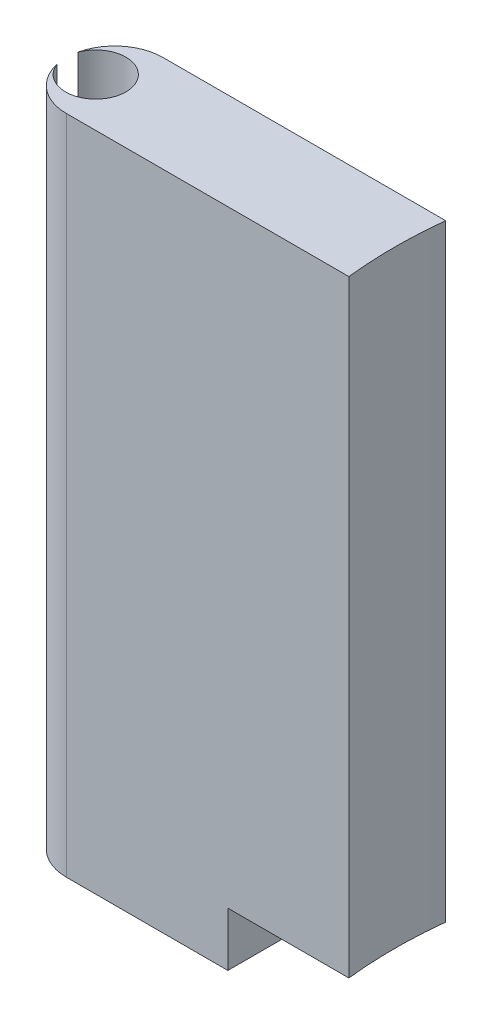
ISO-10303-21;
HEADER;
FILE_DESCRIPTION(('STEP AP214'),'2;1');
FILE_NAME('part.step','',(''),(''),'','','');
FILE_SCHEMA(('AUTOMOTIVE_DESIGN { 1 0 10303 214 1 1 1 1 }'));
ENDSEC;
DATA;
#1=APPLICATION_CONTEXT('core data for automotive mechanical design processes');
#2=APPLICATION_PROTOCOL_DEFINITION('international standard','automotive_design',2000,#1);
#3=PRODUCT_CONTEXT('',#1,'mechanical');
#4=PRODUCT('Part','Part','',(#3));
#5=PRODUCT_RELATED_PRODUCT_CATEGORY('part','',(#4));
#6=PRODUCT_DEFINITION_FORMATION('','',#4);
#7=PRODUCT_DEFINITION_CONTEXT('part definition',#1,'design');
#8=PRODUCT_DEFINITION('design','',#6,#7);
#9=PRODUCT_DEFINITION_SHAPE('','',#8);
#10=(LENGTH_UNIT() NAMED_UNIT(*) SI_UNIT(.MILLI.,.METRE.));
#11=(NAMED_UNIT(*) PLANE_ANGLE_UNIT() SI_UNIT($,.RADIAN.));
#12=(NAMED_UNIT(*) SI_UNIT($,.STERADIAN.) SOLID_ANGLE_UNIT());
#13=UNCERTAINTY_MEASURE_WITH_UNIT(LENGTH_MEASURE(1.E-05),#10,'distance_accuracy_value','');
#14=(GEOMETRIC_REPRESENTATION_CONTEXT(3) GLOBAL_UNCERTAINTY_ASSIGNED_CONTEXT((#13)) GLOBAL_UNIT_ASSIGNED_CONTEXT((#10,
#11,#12)) REPRESENTATION_CONTEXT('',''));
#15=CARTESIAN_POINT('',(0.,0.,0.));
#16=DIRECTION('',(0.,0.,1.));
#17=DIRECTION('',(1.,0.,0.));
#18=AXIS2_PLACEMENT_3D('',#15,#16,#17);
#19=CARTESIAN_POINT('',(-113.595187486441,104.14,0.));
#20=DIRECTION('',(0.,-1.,0.));
#21=DIRECTION('',(0.,0.,-1.));
#22=AXIS2_PLACEMENT_3D('',#19,#20,#21);
#23=CYLINDRICAL_SURFACE('',#22,7.62);
#24=CARTESIAN_POINT('',(-113.595187486441,0.,0.));
#25=DIRECTION('',(0.,1.,0.));
#26=DIRECTION('',(0.,0.,1.));
#27=AXIS2_PLACEMENT_3D('',#24,#25,#26);
#28=CIRCLE('',#27,7.62);
#29=CARTESIAN_POINT('',(-113.595187486441,0.,-7.62000000000001));
#30=VERTEX_POINT('',#29);
#31=CARTESIAN_POINT('',(-121.036253930142,0.,-1.64162425068353));
#32=VERTEX_POINT('',#31);
#33=EDGE_CURVE('E158',#30,#32,#28,.T.);
#34=ORIENTED_EDGE('',*,*,#33,.T.);
#35=DIRECTION('',(0.,1.,0.));
#36=VECTOR('',#35,1.);
#37=CARTESIAN_POINT('',(-121.036253930142,52.07,-1.64162425068353));
#38=LINE('',#37,#36);
#39=CARTESIAN_POINT('',(-121.036253930142,104.14,-1.64162425068353));
#40=VERTEX_POINT('',#39);
#41=EDGE_CURVE('E69',#32,#40,#38,.T.);
#42=ORIENTED_EDGE('',*,*,#41,.T.);
#43=CARTESIAN_POINT('',(-113.595187486441,104.14,0.));
#44=DIRECTION('',(0.,1.,0.));
#45=DIRECTION('',(0.,0.,1.));
#46=AXIS2_PLACEMENT_3D('',#43,#44,#45);
#47=CIRCLE('',#46,7.62);
#48=CARTESIAN_POINT('',(-113.595187486441,104.14,-7.62000000000001));
#49=VERTEX_POINT('',#48);
#50=EDGE_CURVE('E170',#49,#40,#47,.T.);
#51=ORIENTED_EDGE('',*,*,#50,.F.);
#52=DIRECTION('',(0.,-1.,0.));
#53=VECTOR('',#52,1.);
#54=CARTESIAN_POINT('',(-113.595187486441,104.14,-7.62000000000001));
#55=LINE('',#54,#53);
#56=EDGE_CURVE('E144',#49,#30,#55,.T.);
#57=ORIENTED_EDGE('',*,*,#56,.T.);
#58=EDGE_LOOP('',(#34,#42,#51,#57));
#59=FACE_BOUND('',#58,.T.);
#60=ADVANCED_FACE('F45',(#59),#23,.T.);
#61=CARTESIAN_POINT('',(-121.036253930142,104.14,1.64162425068354));
#62=VERTEX_POINT('',#61);
#63=CARTESIAN_POINT('',(-113.595187486441,104.14,7.61999999999999));
#64=VERTEX_POINT('',#63);
#65=EDGE_CURVE('E154',#62,#64,#47,.T.);
#66=ORIENTED_EDGE('',*,*,#65,.F.);
#67=DIRECTION('',(0.,1.,0.));
#68=VECTOR('',#67,1.);
#69=CARTESIAN_POINT('',(-121.036253930142,52.07,1.64162425068354));
#70=LINE('',#69,#68);
#71=CARTESIAN_POINT('',(-121.036253930142,0.,1.64162425068354));
#72=VERTEX_POINT('',#71);
#73=EDGE_CURVE('E176',#62,#72,#70,.F.);
#74=ORIENTED_EDGE('',*,*,#73,.T.);
#75=CARTESIAN_POINT('',(-113.595187486441,0.,7.61999999999999));
#76=VERTEX_POINT('',#75);
#77=EDGE_CURVE('E162',#72,#76,#28,.T.);
#78=ORIENTED_EDGE('',*,*,#77,.T.);
#79=DIRECTION('',(0.,-1.,0.));
#80=VECTOR('',#79,1.);
#81=CARTESIAN_POINT('',(-113.595187486441,104.14,7.61999999999999));
#82=LINE('',#81,#80);
#83=EDGE_CURVE('E54',#64,#76,#82,.T.);
#84=ORIENTED_EDGE('',*,*,#83,.F.);
#85=EDGE_LOOP('',(#66,#74,#78,#84));
#86=FACE_BOUND('',#85,.T.);
#87=ADVANCED_FACE('F47',(#86),#23,.T.);
#88=CARTESIAN_POINT('',(-113.595187486441,104.14,7.61999999999999));
#89=DIRECTION('',(0.,0.,-1.));
#90=DIRECTION('',(-1.,0.,0.));
#91=AXIS2_PLACEMENT_3D('',#88,#89,#90);
#92=PLANE('',#91);
#93=DIRECTION('',(1.,0.,0.));
#94=VECTOR('',#93,1.);
#95=CARTESIAN_POINT('',(-113.595187486441,0.,7.61999999999999));
#96=LINE('',#95,#94);
#97=CARTESIAN_POINT('',(-88.161187486441,0.,7.61999999999999));
#98=VERTEX_POINT('',#97);
#99=EDGE_CURVE('E155',#76,#98,#96,.T.);
#100=ORIENTED_EDGE('',*,*,#99,.T.);
#101=DIRECTION('',(0.,-1.,0.));
#102=VECTOR('',#101,1.);
#103=CARTESIAN_POINT('',(-88.161187486441,8.5,7.62));
#104=LINE('',#103,#102);
#105=CARTESIAN_POINT('',(-88.161187486441,8.5,7.62));
#106=VERTEX_POINT('',#105);
#107=EDGE_CURVE('E61',#106,#98,#104,.T.);
#108=ORIENTED_EDGE('',*,*,#107,.F.);
#109=DIRECTION('',(-1.,0.,0.));
#110=VECTOR('',#109,1.);
#111=CARTESIAN_POINT('',(-69.111187486441,8.5,7.62));
#112=LINE('',#111,#110);
#113=CARTESIAN_POINT('',(-69.111187486441,8.5,7.62));
#114=VERTEX_POINT('',#113);
#115=EDGE_CURVE('E114',#114,#106,#112,.T.);
#116=ORIENTED_EDGE('',*,*,#115,.F.);
#117=DIRECTION('',(0.,-1.,0.));
#118=VECTOR('',#117,1.);
#119=CARTESIAN_POINT('',(-69.111187486441,104.14,7.62));
#120=LINE('',#119,#118);
#121=CARTESIAN_POINT('',(-69.111187486441,104.14,7.62));
#122=VERTEX_POINT('',#121);
#123=EDGE_CURVE('E130',#122,#114,#120,.T.);
#124=ORIENTED_EDGE('',*,*,#123,.F.);
#125=DIRECTION('',(1.,0.,0.));
#126=VECTOR('',#125,1.);
#127=CARTESIAN_POINT('',(-113.595187486441,104.14,7.61999999999999));
#128=LINE('',#127,#126);
#129=EDGE_CURVE('E167',#64,#122,#128,.T.);
#130=ORIENTED_EDGE('',*,*,#129,.F.);
#131=ORIENTED_EDGE('',*,*,#83,.T.);
#132=EDGE_LOOP('',(#100,#108,#116,#124,#130,#131));
#133=FACE_BOUND('',#132,.T.);
#134=ADVANCED_FACE('F128',(#133),#92,.F.);
#135=CARTESIAN_POINT('',(0.,104.14,0.));
#136=DIRECTION('',(0.,-1.,0.));
#137=DIRECTION('',(0.,0.,-1.));
#138=AXIS2_PLACEMENT_3D('',#135,#136,#137);
#139=CYLINDRICAL_SURFACE('',#138,69.5299981);
#140=ORIENTED_EDGE('',*,*,#123,.T.);
#141=CARTESIAN_POINT('',(0.,8.50000000000001,0.));
#142=DIRECTION('',(0.,1.,0.));
#143=DIRECTION('',(0.,0.,1.));
#144=AXIS2_PLACEMENT_3D('',#141,#142,#143);
#145=CIRCLE('',#144,69.5299981);
#146=CARTESIAN_POINT('',(-69.111187486441,8.5,-7.62000000000001));
#147=VERTEX_POINT('',#146);
#148=EDGE_CURVE('E110',#114,#147,#145,.F.);
#149=ORIENTED_EDGE('',*,*,#148,.T.);
#150=DIRECTION('',(0.,-1.,0.));
#151=VECTOR('',#150,1.);
#152=CARTESIAN_POINT('',(-69.111187486441,104.14,-7.62000000000001));
#153=LINE('',#152,#151);
#154=CARTESIAN_POINT('',(-69.111187486441,104.14,-7.62000000000001));
#155=VERTEX_POINT('',#154);
#156=EDGE_CURVE('E139',#155,#147,#153,.T.);
#157=ORIENTED_EDGE('',*,*,#156,.F.);
#158=CARTESIAN_POINT('',(0.,104.14,0.));
#159=DIRECTION('',(0.,-1.,0.));
#160=DIRECTION('',(0.,0.,1.));
#161=AXIS2_PLACEMENT_3D('',#158,#159,#160);
#162=CIRCLE('',#161,69.5299981);
#163=EDGE_CURVE('E137',#122,#155,#162,.T.);
#164=ORIENTED_EDGE('',*,*,#163,.F.);
#165=EDGE_LOOP('',(#140,#149,#157,#164));
#166=FACE_BOUND('',#165,.T.);
#167=ADVANCED_FACE('F136',(#166),#139,.F.);
#168=CARTESIAN_POINT('',(-113.595187486441,104.14,-7.62000000000001));
#169=DIRECTION('',(0.,0.,1.));
#170=DIRECTION('',(1.,0.,0.));
#171=AXIS2_PLACEMENT_3D('',#168,#169,#170);
#172=PLANE('',#171);
#173=DIRECTION('',(1.,0.,0.));
#174=VECTOR('',#173,1.);
#175=CARTESIAN_POINT('',(-69.111187486441,8.5,-7.62000000000001));
#176=LINE('',#175,#174);
#177=CARTESIAN_POINT('',(-88.161187486441,8.5,-7.62000000000001));
#178=VERTEX_POINT('',#177);
#179=EDGE_CURVE('E116',#178,#147,#176,.T.);
#180=ORIENTED_EDGE('',*,*,#179,.F.);
#181=DIRECTION('',(0.,-1.,0.));
#182=VECTOR('',#181,1.);
#183=CARTESIAN_POINT('',(-88.161187486441,8.5,-7.62000000000001));
#184=LINE('',#183,#182);
#185=CARTESIAN_POINT('',(-88.161187486441,0.,-7.62000000000001));
#186=VERTEX_POINT('',#185);
#187=EDGE_CURVE('E123',#178,#186,#184,.T.);
#188=ORIENTED_EDGE('',*,*,#187,.T.);
#189=DIRECTION('',(-1.,0.,0.));
#190=VECTOR('',#189,1.);
#191=CARTESIAN_POINT('',(-113.595187486441,0.,-7.62000000000001));
#192=LINE('',#191,#190);
#193=EDGE_CURVE('E151',#186,#30,#192,.T.);
#194=ORIENTED_EDGE('',*,*,#193,.T.);
#195=ORIENTED_EDGE('',*,*,#56,.F.);
#196=DIRECTION('',(-1.,0.,0.));
#197=VECTOR('',#196,1.);
#198=CARTESIAN_POINT('',(-113.595187486441,104.14,-7.62000000000001));
#199=LINE('',#198,#197);
#200=EDGE_CURVE('E150',#155,#49,#199,.T.);
#201=ORIENTED_EDGE('',*,*,#200,.F.);
#202=ORIENTED_EDGE('',*,*,#156,.T.);
#203=EDGE_LOOP('',(#180,#188,#194,#195,#201,#202));
#204=FACE_BOUND('',#203,.T.);
#205=ADVANCED_FACE('F242',(#204),#172,.F.);
#206=CARTESIAN_POINT('',(-113.595187486441,104.14,0.));
#207=DIRECTION('',(0.,1.,0.));
#208=DIRECTION('',(0.,0.,1.));
#209=AXIS2_PLACEMENT_3D('',#206,#207,#208);
#210=PLANE('',#209);
#211=CARTESIAN_POINT('',(-116.578948710666,104.14,0.));
#212=DIRECTION('',(0.,1.,0.));
#213=DIRECTION('',(0.,0.,1.));
#214=AXIS2_PLACEMENT_3D('',#211,#212,#213);
#215=CIRCLE('',#214,4.75);
#216=EDGE_CURVE('E122',#62,#40,#215,.T.);
#217=ORIENTED_EDGE('',*,*,#216,.F.);
#218=ORIENTED_EDGE('',*,*,#65,.T.);
#219=ORIENTED_EDGE('',*,*,#129,.T.);
#220=ORIENTED_EDGE('',*,*,#163,.T.);
#221=ORIENTED_EDGE('',*,*,#200,.T.);
#222=ORIENTED_EDGE('',*,*,#50,.T.);
#223=EDGE_LOOP('',(#217,#218,#219,#220,#221,#222));
#224=FACE_BOUND('',#223,.T.);
#225=ADVANCED_FACE('F240',(#224),#210,.T.);
#226=CARTESIAN_POINT('',(-113.595187486441,0.,0.));
#227=DIRECTION('',(0.,1.,0.));
#228=DIRECTION('',(0.,0.,1.));
#229=AXIS2_PLACEMENT_3D('',#226,#227,#228);
#230=PLANE('',#229);
#231=ORIENTED_EDGE('',*,*,#193,.F.);
#232=DIRECTION('',(0.,0.,-1.));
#233=VECTOR('',#232,1.);
#234=CARTESIAN_POINT('',(-88.161187486441,0.,7.62));
#235=LINE('',#234,#233);
#236=EDGE_CURVE('E134',#98,#186,#235,.T.);
#237=ORIENTED_EDGE('',*,*,#236,.F.);
#238=ORIENTED_EDGE('',*,*,#99,.F.);
#239=ORIENTED_EDGE('',*,*,#77,.F.);
#240=CARTESIAN_POINT('',(-116.578948710666,0.,0.));
#241=DIRECTION('',(0.,1.,0.));
#242=DIRECTION('',(0.,0.,1.));
#243=AXIS2_PLACEMENT_3D('',#240,#241,#242);
#244=CIRCLE('',#243,4.75);
#245=EDGE_CURVE('E11',#72,#32,#244,.T.);
#246=ORIENTED_EDGE('',*,*,#245,.T.);
#247=ORIENTED_EDGE('',*,*,#33,.F.);
#248=EDGE_LOOP('',(#231,#237,#238,#239,#246,#247));
#249=FACE_BOUND('',#248,.T.);
#250=ADVANCED_FACE('F219',(#249),#230,.F.);
#251=CARTESIAN_POINT('',(-116.578948710666,-13.4350288425444,0.));
#252=DIRECTION('',(0.,1.,0.));
#253=DIRECTION('',(0.,0.,1.));
#254=AXIS2_PLACEMENT_3D('',#251,#252,#253);
#255=CYLINDRICAL_SURFACE('',#254,4.75);
#256=ORIENTED_EDGE('',*,*,#245,.F.);
#257=ORIENTED_EDGE('',*,*,#73,.F.);
#258=ORIENTED_EDGE('',*,*,#216,.T.);
#259=ORIENTED_EDGE('',*,*,#41,.F.);
#260=EDGE_LOOP('',(#256,#257,#258,#259));
#261=FACE_BOUND('',#260,.T.);
#262=ADVANCED_FACE('F212',(#261),#255,.F.);
#263=CARTESIAN_POINT('',(0.,8.5,0.));
#264=DIRECTION('',(0.,1.,0.));
#265=DIRECTION('',(0.,0.,1.));
#266=AXIS2_PLACEMENT_3D('',#263,#264,#265);
#267=PLANE('',#266);
#268=CARTESIAN_POINT('',(-77.3230717780463,8.5,0.));
#269=DIRECTION('',(0.,-1.,0.));
#270=DIRECTION('',(0.,0.,-1.));
#271=AXIS2_PLACEMENT_3D('',#268,#269,#270);
#272=CIRCLE('',#271,3.00000000000001);
#273=CARTESIAN_POINT('',(-77.3230717780463,8.5,-2.99999999999999));
#274=VERTEX_POINT('',#273);
#275=EDGE_CURVE('E194',#274,#274,#272,.T.);
#276=ORIENTED_EDGE('',*,*,#275,.F.);
#277=EDGE_LOOP('',(#276));
#278=FACE_BOUND('',#277,.T.);
#279=ORIENTED_EDGE('',*,*,#115,.T.);
#280=DIRECTION('',(0.,0.,-1.));
#281=VECTOR('',#280,1.);
#282=CARTESIAN_POINT('',(-88.161187486441,8.5,7.62));
#283=LINE('',#282,#281);
#284=EDGE_CURVE('E133',#106,#178,#283,.T.);
#285=ORIENTED_EDGE('',*,*,#284,.T.);
#286=ORIENTED_EDGE('',*,*,#179,.T.);
#287=ORIENTED_EDGE('',*,*,#148,.F.);
#288=EDGE_LOOP('',(#279,#285,#286,#287));
#289=FACE_BOUND('',#288,.T.);
#290=ADVANCED_FACE('F112',(#278,#289),#267,.F.);
#291=CARTESIAN_POINT('',(-88.161187486441,8.5,7.62));
#292=DIRECTION('',(-1.,0.,0.));
#293=DIRECTION('',(0.,0.,1.));
#294=AXIS2_PLACEMENT_3D('',#291,#292,#293);
#295=PLANE('',#294);
#296=ORIENTED_EDGE('',*,*,#236,.T.);
#297=ORIENTED_EDGE('',*,*,#187,.F.);
#298=ORIENTED_EDGE('',*,*,#284,.F.);
#299=ORIENTED_EDGE('',*,*,#107,.T.);
#300=EDGE_LOOP('',(#296,#297,#298,#299));
#301=FACE_BOUND('',#300,.T.);
#302=ADVANCED_FACE('F207',(#301),#295,.F.);
#303=CARTESIAN_POINT('',(-77.3230717780463,27.55,0.));
#304=DIRECTION('',(0.,-1.,0.));
#305=DIRECTION('',(0.,0.,-1.));
#306=AXIS2_PLACEMENT_3D('',#303,#304,#305);
#307=CYLINDRICAL_SURFACE('',#306,3.00000000000001);
#308=CARTESIAN_POINT('',(-77.3230717780463,27.55,0.));
#309=DIRECTION('',(0.,-1.,0.));
#310=DIRECTION('',(0.,0.,-1.));
#311=AXIS2_PLACEMENT_3D('',#308,#309,#310);
#312=CIRCLE('',#311,3.00000000000001);
#313=CARTESIAN_POINT('',(-77.3230717780463,27.55,-2.99999999999999));
#314=VERTEX_POINT('',#313);
#315=EDGE_CURVE('E189',#314,#314,#312,.T.);
#316=CARTESIAN_POINT('',(-77.3230717780463,27.55,-2.99999999999999));
#317=CARTESIAN_POINT('',(-77.3230717780463,27.3515625,-2.99999999999999));
#318=CARTESIAN_POINT('',(-77.3230717780463,27.153125,-2.99999999999999));
#319=CARTESIAN_POINT('',(-77.3230717780463,26.75625,-2.99999999999999));
#320=CARTESIAN_POINT('',(-77.3230717780463,26.5578125,-2.99999999999999));
#321=CARTESIAN_POINT('',(-77.3230717780463,26.1609375,-2.99999999999999));
#322=CARTESIAN_POINT('',(-77.3230717780463,25.9625,-2.99999999999999));
#323=CARTESIAN_POINT('',(-77.3230717780463,25.565625,-2.99999999999999));
#324=CARTESIAN_POINT('',(-77.3230717780463,25.3671875,-2.99999999999999));
#325=CARTESIAN_POINT('',(-77.3230717780463,24.9703125,-2.99999999999999));
#326=CARTESIAN_POINT('',(-77.3230717780463,24.771875,-2.99999999999999));
#327=CARTESIAN_POINT('',(-77.3230717780463,24.375,-2.99999999999999));
#328=CARTESIAN_POINT('',(-77.3230717780463,24.1765625,-2.99999999999999));
#329=CARTESIAN_POINT('',(-77.3230717780463,23.7796875,-2.99999999999999));
#330=CARTESIAN_POINT('',(-77.3230717780463,23.58125,-2.99999999999999));
#331=CARTESIAN_POINT('',(-77.3230717780463,23.184375,-2.99999999999999));
#332=CARTESIAN_POINT('',(-77.3230717780463,22.9859375,-2.99999999999999));
#333=CARTESIAN_POINT('',(-77.3230717780463,22.5890625,-2.99999999999999));
#334=CARTESIAN_POINT('',(-77.3230717780463,22.390625,-2.99999999999999));
#335=CARTESIAN_POINT('',(-77.3230717780463,21.99375,-2.99999999999999));
#336=CARTESIAN_POINT('',(-77.3230717780463,21.7953125,-2.99999999999999));
#337=CARTESIAN_POINT('',(-77.3230717780463,21.3984375,-2.99999999999999));
#338=CARTESIAN_POINT('',(-77.3230717780463,21.2,-2.99999999999999));
#339=CARTESIAN_POINT('',(-77.3230717780463,20.803125,-2.99999999999999));
#340=CARTESIAN_POINT('',(-77.3230717780463,20.6046875,-2.99999999999999));
#341=CARTESIAN_POINT('',(-77.3230717780463,20.2078125,-2.99999999999999));
#342=CARTESIAN_POINT('',(-77.3230717780463,20.009375,-2.99999999999999));
#343=CARTESIAN_POINT('',(-77.3230717780463,19.6125,-2.99999999999999));
#344=CARTESIAN_POINT('',(-77.3230717780463,19.4140625,-2.99999999999999));
#345=CARTESIAN_POINT('',(-77.3230717780463,19.0171875,-2.99999999999999));
#346=CARTESIAN_POINT('',(-77.3230717780463,18.81875,-2.99999999999999));
#347=CARTESIAN_POINT('',(-77.3230717780463,18.421875,-2.99999999999999));
#348=CARTESIAN_POINT('',(-77.3230717780463,18.2234375,-2.99999999999999));
#349=CARTESIAN_POINT('',(-77.3230717780463,17.8265625,-2.99999999999999));
#350=CARTESIAN_POINT('',(-77.3230717780463,17.628125,-2.99999999999999));
#351=CARTESIAN_POINT('',(-77.3230717780463,17.23125,-2.99999999999999));
#352=CARTESIAN_POINT('',(-77.3230717780463,17.0328125,-2.99999999999999));
#353=CARTESIAN_POINT('',(-77.3230717780463,16.6359375,-2.99999999999999));
#354=CARTESIAN_POINT('',(-77.3230717780463,16.4375,-2.99999999999999));
#355=CARTESIAN_POINT('',(-77.3230717780463,16.040625,-2.99999999999999));
#356=CARTESIAN_POINT('',(-77.3230717780463,15.8421875,-2.99999999999999));
#357=CARTESIAN_POINT('',(-77.3230717780463,15.4453125,-2.99999999999999));
#358=CARTESIAN_POINT('',(-77.3230717780463,15.246875,-2.99999999999999));
#359=CARTESIAN_POINT('',(-77.3230717780463,14.85,-2.99999999999999));
#360=CARTESIAN_POINT('',(-77.3230717780463,14.6515625,-2.99999999999999));
#361=CARTESIAN_POINT('',(-77.3230717780463,14.2546875,-2.99999999999999));
#362=CARTESIAN_POINT('',(-77.3230717780463,14.05625,-2.99999999999999));
#363=CARTESIAN_POINT('',(-77.3230717780463,13.659375,-2.99999999999999));
#364=CARTESIAN_POINT('',(-77.3230717780463,13.4609375,-2.99999999999999));
#365=CARTESIAN_POINT('',(-77.3230717780463,13.0640625,-2.99999999999999));
#366=CARTESIAN_POINT('',(-77.3230717780463,12.865625,-2.99999999999999));
#367=CARTESIAN_POINT('',(-77.3230717780463,12.46875,-2.99999999999999));
#368=CARTESIAN_POINT('',(-77.3230717780463,12.2703125,-2.99999999999999));
#369=CARTESIAN_POINT('',(-77.3230717780463,11.8734375,-2.99999999999999));
#370=CARTESIAN_POINT('',(-77.3230717780463,11.675,-2.99999999999999));
#371=CARTESIAN_POINT('',(-77.3230717780463,11.278125,-2.99999999999999));
#372=CARTESIAN_POINT('',(-77.3230717780463,11.0796875,-2.99999999999999));
#373=CARTESIAN_POINT('',(-77.3230717780463,10.6828125,-2.99999999999999));
#374=CARTESIAN_POINT('',(-77.3230717780463,10.484375,-2.99999999999999));
#375=CARTESIAN_POINT('',(-77.3230717780463,10.0875,-2.99999999999999));
#376=CARTESIAN_POINT('',(-77.3230717780463,9.8890625,-2.99999999999999));
#377=CARTESIAN_POINT('',(-77.3230717780463,9.4921875,-2.99999999999999));
#378=CARTESIAN_POINT('',(-77.3230717780463,9.29375,-2.99999999999999));
#379=CARTESIAN_POINT('',(-77.3230717780463,8.896875,-2.99999999999999));
#380=CARTESIAN_POINT('',(-77.3230717780463,8.6984375,-2.99999999999999));
#381=CARTESIAN_POINT('',(-77.3230717780463,8.5,-2.99999999999999));
#382=B_SPLINE_CURVE_WITH_KNOTS('',3,(#316,#317,#318,#319,#320,#321,#322,#323,#324,#325,#326,
#327,#328,#329,#330,#331,#332,#333,#334,#335,#336,#337,#338,#339,#340,#341,#342,#343,#344,#345,
#346,#347,#348,#349,#350,#351,#352,#353,#354,#355,#356,#357,#358,#359,#360,#361,#362,#363,#364,
#365,#366,#367,#368,#369,#370,#371,#372,#373,#374,#375,#376,#377,#378,#379,#380,#381),
.UNSPECIFIED.,.F.,.F.,(4,2,2,2,2,2,2,2,2,2,2,2,2,2,2,2,2,2,2,2,2,2,2,2,2,2,2,2,2,2,2,2,4),(0.,
0.595312499999997,1.190625,1.7859375,2.38125,2.9765625,3.571875,4.1671875,4.7625,5.3578125,
5.953125,6.5484375,7.14375,7.7390625,8.334375,8.9296875,9.525,10.1203125,10.715625,11.3109375,
11.90625,12.5015625,13.096875,13.6921875,14.2875,14.8828125,15.478125,16.0734375,16.66875,
17.2640625,17.859375,18.4546875,19.05),.UNSPECIFIED.);
#383=EDGE_CURVE('BSEAM204',#314,#274,#382,.T.);
#384=ORIENTED_EDGE('',*,*,#315,.F.);
#385=ORIENTED_EDGE('',*,*,#275,.T.);
#386=ORIENTED_EDGE('',*,*,#383,.T.);
#387=ORIENTED_EDGE('',*,*,#383,.F.);
#388=EDGE_LOOP('',(#384,#386,#385,#387));
#389=FACE_BOUND('',#388,.T.);
#390=ADVANCED_FACE('F204',(#389),#307,.F.);
#391=CARTESIAN_POINT('',(-77.3230717780463,27.55,0.));
#392=DIRECTION('',(0.,-1.,0.));
#393=DIRECTION('',(0.,0.,-1.));
#394=AXIS2_PLACEMENT_3D('',#391,#392,#393);
#395=PLANE('',#394);
#396=ORIENTED_EDGE('',*,*,#315,.T.);
#397=EDGE_LOOP('',(#396));
#398=FACE_BOUND('',#397,.T.);
#399=ADVANCED_FACE('F202',(#398),#395,.T.);
#400=CLOSED_SHELL('',(#60,#87,#134,#167,#205,#225,#250,#262,#290,#302,#390,#399));
#401=MANIFOLD_SOLID_BREP('B2',#400);
#402=ADVANCED_BREP_SHAPE_REPRESENTATION('',(#18,#401),#14);
#403=SHAPE_DEFINITION_REPRESENTATION(#9,#402);
ENDSEC;
END-ISO-10303-21;
